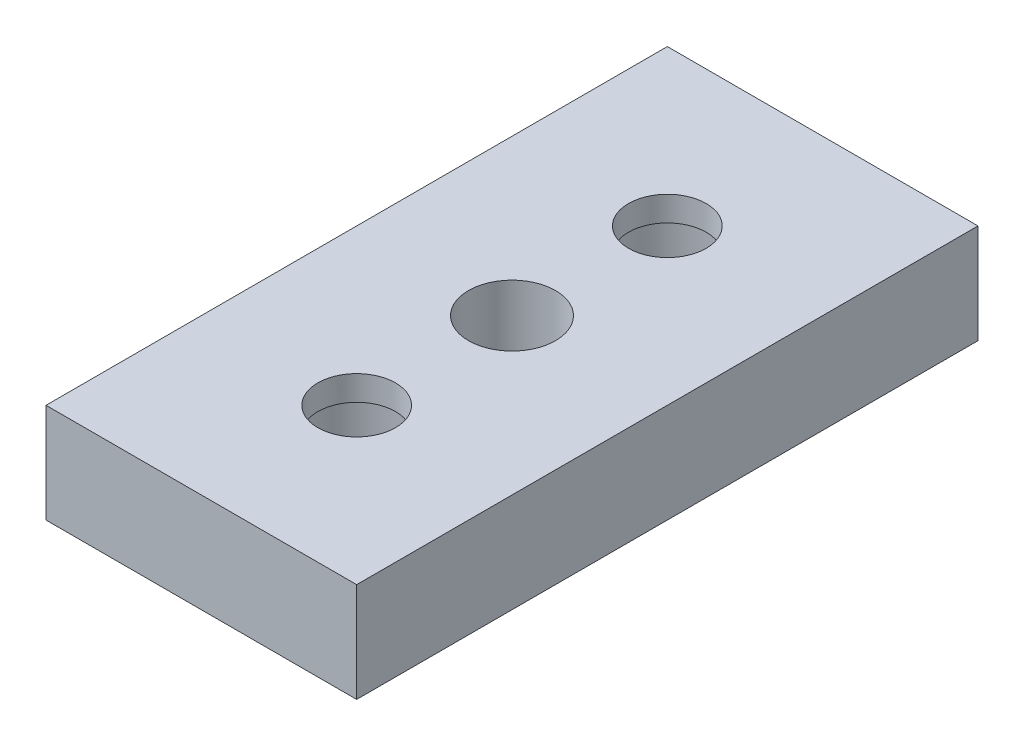
ISO-10303-21;
HEADER;
FILE_DESCRIPTION(('STEP AP214'),'2;1');
FILE_NAME('part.step','',(''),(''),'','','');
FILE_SCHEMA(('AUTOMOTIVE_DESIGN { 1 0 10303 214 1 1 1 1 }'));
ENDSEC;
DATA;
#1=APPLICATION_CONTEXT('core data for automotive mechanical design processes');
#2=APPLICATION_PROTOCOL_DEFINITION('international standard','automotive_design',2000,#1);
#3=PRODUCT_CONTEXT('',#1,'mechanical');
#4=PRODUCT('Part','Part','',(#3));
#5=PRODUCT_RELATED_PRODUCT_CATEGORY('part','',(#4));
#6=PRODUCT_DEFINITION_FORMATION('','',#4);
#7=PRODUCT_DEFINITION_CONTEXT('part definition',#1,'design');
#8=PRODUCT_DEFINITION('design','',#6,#7);
#9=PRODUCT_DEFINITION_SHAPE('','',#8);
#10=(LENGTH_UNIT() NAMED_UNIT(*) SI_UNIT(.MILLI.,.METRE.));
#11=(NAMED_UNIT(*) PLANE_ANGLE_UNIT() SI_UNIT($,.RADIAN.));
#12=(NAMED_UNIT(*) SI_UNIT($,.STERADIAN.) SOLID_ANGLE_UNIT());
#13=UNCERTAINTY_MEASURE_WITH_UNIT(LENGTH_MEASURE(1.E-05),#10,'distance_accuracy_value','');
#14=(GEOMETRIC_REPRESENTATION_CONTEXT(3) GLOBAL_UNCERTAINTY_ASSIGNED_CONTEXT((#13)) GLOBAL_UNIT_ASSIGNED_CONTEXT((#10,
#11,#12)) REPRESENTATION_CONTEXT('',''));
#15=CARTESIAN_POINT('',(0.,0.,0.));
#16=DIRECTION('',(0.,0.,1.));
#17=DIRECTION('',(1.,0.,0.));
#18=AXIS2_PLACEMENT_3D('',#15,#16,#17);
#19=CARTESIAN_POINT('',(25.,16.,-75.));
#20=DIRECTION('',(0.,-1.,0.));
#21=DIRECTION('',(0.,0.,-1.));
#22=AXIS2_PLACEMENT_3D('',#19,#20,#21);
#23=CYLINDRICAL_SURFACE('',#22,6.25);
#24=CARTESIAN_POINT('',(25.,16.,-75.));
#25=DIRECTION('',(0.,1.,0.));
#26=DIRECTION('',(0.,0.,1.));
#27=AXIS2_PLACEMENT_3D('',#24,#25,#26);
#28=CIRCLE('',#27,6.25);
#29=CARTESIAN_POINT('',(25.,16.,-68.75));
#30=VERTEX_POINT('',#29);
#31=EDGE_CURVE('E108',#30,#30,#28,.T.);
#32=ORIENTED_EDGE('',*,*,#31,.T.);
#33=EDGE_LOOP('',(#32));
#34=FACE_BOUND('',#33,.T.);
#35=CARTESIAN_POINT('',(25.,12.,-75.));
#36=DIRECTION('',(0.,-1.,0.));
#37=DIRECTION('',(0.,0.,-1.));
#38=AXIS2_PLACEMENT_3D('',#35,#36,#37);
#39=CIRCLE('',#38,6.25);
#40=CARTESIAN_POINT('',(25.,12.,-81.25));
#41=VERTEX_POINT('',#40);
#42=EDGE_CURVE('E41',#41,#41,#39,.T.);
#43=ORIENTED_EDGE('',*,*,#42,.T.);
#44=EDGE_LOOP('',(#43));
#45=FACE_BOUND('',#44,.T.);
#46=ADVANCED_FACE('F37',(#34,#45),#23,.F.);
#47=CARTESIAN_POINT('',(25.,16.,-25.));
#48=DIRECTION('',(0.,-1.,0.));
#49=DIRECTION('',(0.,0.,-1.));
#50=AXIS2_PLACEMENT_3D('',#47,#48,#49);
#51=CYLINDRICAL_SURFACE('',#50,6.25);
#52=CARTESIAN_POINT('',(25.,16.,-25.));
#53=DIRECTION('',(0.,1.,0.));
#54=DIRECTION('',(0.,0.,1.));
#55=AXIS2_PLACEMENT_3D('',#52,#53,#54);
#56=CIRCLE('',#55,6.25);
#57=CARTESIAN_POINT('',(25.,16.,-18.75));
#58=VERTEX_POINT('',#57);
#59=EDGE_CURVE('E116',#58,#58,#56,.T.);
#60=ORIENTED_EDGE('',*,*,#59,.T.);
#61=EDGE_LOOP('',(#60));
#62=FACE_BOUND('',#61,.T.);
#63=CARTESIAN_POINT('',(25.,12.,-25.));
#64=DIRECTION('',(0.,-1.,0.));
#65=DIRECTION('',(0.,0.,-1.));
#66=AXIS2_PLACEMENT_3D('',#63,#64,#65);
#67=CIRCLE('',#66,6.25);
#68=CARTESIAN_POINT('',(25.,12.,-31.25));
#69=VERTEX_POINT('',#68);
#70=EDGE_CURVE('E118',#69,#69,#67,.T.);
#71=ORIENTED_EDGE('',*,*,#70,.T.);
#72=EDGE_LOOP('',(#71));
#73=FACE_BOUND('',#72,.T.);
#74=ADVANCED_FACE('F145',(#62,#73),#51,.F.);
#75=CARTESIAN_POINT('',(0.,16.,0.));
#76=DIRECTION('',(0.,1.,0.));
#77=DIRECTION('',(0.,0.,1.));
#78=AXIS2_PLACEMENT_3D('',#75,#76,#77);
#79=PLANE('',#78);
#80=CARTESIAN_POINT('',(25.,16.,-50.));
#81=DIRECTION('',(0.,1.,0.));
#82=DIRECTION('',(0.,0.,1.));
#83=AXIS2_PLACEMENT_3D('',#80,#81,#82);
#84=CIRCLE('',#83,7.);
#85=CARTESIAN_POINT('',(25.,16.,-43.));
#86=VERTEX_POINT('',#85);
#87=EDGE_CURVE('E117',#86,#86,#84,.T.);
#88=ORIENTED_EDGE('',*,*,#87,.F.);
#89=EDGE_LOOP('',(#88));
#90=FACE_BOUND('',#89,.T.);
#91=ORIENTED_EDGE('',*,*,#31,.F.);
#92=EDGE_LOOP('',(#91));
#93=FACE_BOUND('',#92,.T.);
#94=DIRECTION('',(0.,0.,1.));
#95=VECTOR('',#94,1.);
#96=CARTESIAN_POINT('',(0.,16.,-100.));
#97=LINE('',#96,#95);
#98=CARTESIAN_POINT('',(0.,16.,-100.));
#99=VERTEX_POINT('',#98);
#100=CARTESIAN_POINT('',(0.,16.,0.));
#101=VERTEX_POINT('',#100);
#102=EDGE_CURVE('E92',#99,#101,#97,.T.);
#103=ORIENTED_EDGE('',*,*,#102,.T.);
#104=DIRECTION('',(1.,0.,0.));
#105=VECTOR('',#104,1.);
#106=CARTESIAN_POINT('',(0.,16.,0.));
#107=LINE('',#106,#105);
#108=CARTESIAN_POINT('',(50.,16.,0.));
#109=VERTEX_POINT('',#108);
#110=EDGE_CURVE('E86',#101,#109,#107,.T.);
#111=ORIENTED_EDGE('',*,*,#110,.T.);
#112=DIRECTION('',(0.,0.,-1.));
#113=VECTOR('',#112,1.);
#114=CARTESIAN_POINT('',(50.,16.,0.));
#115=LINE('',#114,#113);
#116=CARTESIAN_POINT('',(50.,16.,-100.));
#117=VERTEX_POINT('',#116);
#118=EDGE_CURVE('E90',#109,#117,#115,.T.);
#119=ORIENTED_EDGE('',*,*,#118,.T.);
#120=DIRECTION('',(-1.,0.,0.));
#121=VECTOR('',#120,1.);
#122=CARTESIAN_POINT('',(50.,16.,-100.));
#123=LINE('',#122,#121);
#124=EDGE_CURVE('E56',#117,#99,#123,.T.);
#125=ORIENTED_EDGE('',*,*,#124,.T.);
#126=EDGE_LOOP('',(#103,#111,#119,#125));
#127=FACE_BOUND('',#126,.T.);
#128=ORIENTED_EDGE('',*,*,#59,.F.);
#129=EDGE_LOOP('',(#128));
#130=FACE_BOUND('',#129,.T.);
#131=ADVANCED_FACE('F87',(#90,#93,#127,#130),#79,.T.);
#132=CARTESIAN_POINT('',(0.,0.,0.));
#133=DIRECTION('',(0.,1.,0.));
#134=DIRECTION('',(0.,0.,1.));
#135=AXIS2_PLACEMENT_3D('',#132,#133,#134);
#136=PLANE('',#135);
#137=CARTESIAN_POINT('',(25.,0.,-75.));
#138=DIRECTION('',(0.,-1.,0.));
#139=DIRECTION('',(0.,0.,-1.));
#140=AXIS2_PLACEMENT_3D('',#137,#138,#139);
#141=CIRCLE('',#140,9.25);
#142=CARTESIAN_POINT('',(25.,0.,-84.25));
#143=VERTEX_POINT('',#142);
#144=EDGE_CURVE('E133',#143,#143,#141,.T.);
#145=ORIENTED_EDGE('',*,*,#144,.F.);
#146=EDGE_LOOP('',(#145));
#147=FACE_BOUND('',#146,.T.);
#148=CARTESIAN_POINT('',(25.,0.,-25.));
#149=DIRECTION('',(0.,-1.,0.));
#150=DIRECTION('',(0.,0.,-1.));
#151=AXIS2_PLACEMENT_3D('',#148,#149,#150);
#152=CIRCLE('',#151,9.25);
#153=CARTESIAN_POINT('',(25.,0.,-34.25));
#154=VERTEX_POINT('',#153);
#155=EDGE_CURVE('E126',#154,#154,#152,.T.);
#156=ORIENTED_EDGE('',*,*,#155,.F.);
#157=EDGE_LOOP('',(#156));
#158=FACE_BOUND('',#157,.T.);
#159=CARTESIAN_POINT('',(25.,0.,-50.));
#160=DIRECTION('',(0.,1.,0.));
#161=DIRECTION('',(0.,0.,1.));
#162=AXIS2_PLACEMENT_3D('',#159,#160,#161);
#163=CIRCLE('',#162,7.);
#164=CARTESIAN_POINT('',(25.,0.,-43.));
#165=VERTEX_POINT('',#164);
#166=EDGE_CURVE('E114',#165,#165,#163,.T.);
#167=ORIENTED_EDGE('',*,*,#166,.T.);
#168=EDGE_LOOP('',(#167));
#169=FACE_BOUND('',#168,.T.);
#170=DIRECTION('',(0.,0.,1.));
#171=VECTOR('',#170,1.);
#172=CARTESIAN_POINT('',(0.,0.,-100.));
#173=LINE('',#172,#171);
#174=CARTESIAN_POINT('',(0.,0.,-100.));
#175=VERTEX_POINT('',#174);
#176=CARTESIAN_POINT('',(0.,0.,0.));
#177=VERTEX_POINT('',#176);
#178=EDGE_CURVE('E105',#175,#177,#173,.T.);
#179=ORIENTED_EDGE('',*,*,#178,.F.);
#180=DIRECTION('',(-1.,0.,0.));
#181=VECTOR('',#180,1.);
#182=CARTESIAN_POINT('',(50.,0.,-100.));
#183=LINE('',#182,#181);
#184=CARTESIAN_POINT('',(50.,0.,-100.));
#185=VERTEX_POINT('',#184);
#186=EDGE_CURVE('E79',#185,#175,#183,.T.);
#187=ORIENTED_EDGE('',*,*,#186,.F.);
#188=DIRECTION('',(0.,0.,-1.));
#189=VECTOR('',#188,1.);
#190=CARTESIAN_POINT('',(50.,0.,0.));
#191=LINE('',#190,#189);
#192=CARTESIAN_POINT('',(50.,0.,0.));
#193=VERTEX_POINT('',#192);
#194=EDGE_CURVE('E73',#193,#185,#191,.T.);
#195=ORIENTED_EDGE('',*,*,#194,.F.);
#196=DIRECTION('',(1.,0.,0.));
#197=VECTOR('',#196,1.);
#198=CARTESIAN_POINT('',(0.,0.,0.));
#199=LINE('',#198,#197);
#200=EDGE_CURVE('E96',#177,#193,#199,.T.);
#201=ORIENTED_EDGE('',*,*,#200,.F.);
#202=EDGE_LOOP('',(#179,#187,#195,#201));
#203=FACE_BOUND('',#202,.T.);
#204=ADVANCED_FACE('F144',(#147,#158,#169,#203),#136,.F.);
#205=CARTESIAN_POINT('',(0.,16.,-100.));
#206=DIRECTION('',(1.,0.,0.));
#207=DIRECTION('',(0.,0.,-1.));
#208=AXIS2_PLACEMENT_3D('',#205,#206,#207);
#209=PLANE('',#208);
#210=ORIENTED_EDGE('',*,*,#178,.T.);
#211=DIRECTION('',(0.,-1.,0.));
#212=VECTOR('',#211,1.);
#213=CARTESIAN_POINT('',(0.,16.,0.));
#214=LINE('',#213,#212);
#215=EDGE_CURVE('E11',#101,#177,#214,.T.);
#216=ORIENTED_EDGE('',*,*,#215,.F.);
#217=ORIENTED_EDGE('',*,*,#102,.F.);
#218=DIRECTION('',(0.,-1.,0.));
#219=VECTOR('',#218,1.);
#220=CARTESIAN_POINT('',(0.,16.,-100.));
#221=LINE('',#220,#219);
#222=EDGE_CURVE('E101',#99,#175,#221,.T.);
#223=ORIENTED_EDGE('',*,*,#222,.T.);
#224=EDGE_LOOP('',(#210,#216,#217,#223));
#225=FACE_BOUND('',#224,.T.);
#226=ADVANCED_FACE('F39',(#225),#209,.F.);
#227=CARTESIAN_POINT('',(0.,16.,0.));
#228=DIRECTION('',(0.,0.,-1.));
#229=DIRECTION('',(-1.,0.,0.));
#230=AXIS2_PLACEMENT_3D('',#227,#228,#229);
#231=PLANE('',#230);
#232=ORIENTED_EDGE('',*,*,#200,.T.);
#233=DIRECTION('',(0.,-1.,0.));
#234=VECTOR('',#233,1.);
#235=CARTESIAN_POINT('',(50.,16.,0.));
#236=LINE('',#235,#234);
#237=EDGE_CURVE('E47',#109,#193,#236,.T.);
#238=ORIENTED_EDGE('',*,*,#237,.F.);
#239=ORIENTED_EDGE('',*,*,#110,.F.);
#240=ORIENTED_EDGE('',*,*,#215,.T.);
#241=EDGE_LOOP('',(#232,#238,#239,#240));
#242=FACE_BOUND('',#241,.T.);
#243=ADVANCED_FACE('F95',(#242),#231,.F.);
#244=CARTESIAN_POINT('',(50.,16.,0.));
#245=DIRECTION('',(-1.,0.,0.));
#246=DIRECTION('',(0.,0.,1.));
#247=AXIS2_PLACEMENT_3D('',#244,#245,#246);
#248=PLANE('',#247);
#249=ORIENTED_EDGE('',*,*,#194,.T.);
#250=DIRECTION('',(0.,-1.,0.));
#251=VECTOR('',#250,1.);
#252=CARTESIAN_POINT('',(50.,16.,-100.));
#253=LINE('',#252,#251);
#254=EDGE_CURVE('E97',#117,#185,#253,.T.);
#255=ORIENTED_EDGE('',*,*,#254,.F.);
#256=ORIENTED_EDGE('',*,*,#118,.F.);
#257=ORIENTED_EDGE('',*,*,#237,.T.);
#258=EDGE_LOOP('',(#249,#255,#256,#257));
#259=FACE_BOUND('',#258,.T.);
#260=ADVANCED_FACE('F99',(#259),#248,.F.);
#261=CARTESIAN_POINT('',(50.,16.,-100.));
#262=DIRECTION('',(0.,0.,1.));
#263=DIRECTION('',(1.,0.,0.));
#264=AXIS2_PLACEMENT_3D('',#261,#262,#263);
#265=PLANE('',#264);
#266=ORIENTED_EDGE('',*,*,#186,.T.);
#267=ORIENTED_EDGE('',*,*,#222,.F.);
#268=ORIENTED_EDGE('',*,*,#124,.F.);
#269=ORIENTED_EDGE('',*,*,#254,.T.);
#270=EDGE_LOOP('',(#266,#267,#268,#269));
#271=FACE_BOUND('',#270,.T.);
#272=ADVANCED_FACE('F166',(#271),#265,.F.);
#273=CARTESIAN_POINT('',(25.,16.,-50.));
#274=DIRECTION('',(0.,1.,0.));
#275=DIRECTION('',(0.,0.,1.));
#276=AXIS2_PLACEMENT_3D('',#273,#274,#275);
#277=CYLINDRICAL_SURFACE('',#276,7.);
#278=ORIENTED_EDGE('',*,*,#87,.T.);
#279=EDGE_LOOP('',(#278));
#280=FACE_BOUND('',#279,.T.);
#281=ORIENTED_EDGE('',*,*,#166,.F.);
#282=EDGE_LOOP('',(#281));
#283=FACE_BOUND('',#282,.T.);
#284=ADVANCED_FACE('F162',(#280,#283),#277,.F.);
#285=CARTESIAN_POINT('',(25.,12.,-25.));
#286=DIRECTION('',(0.,-1.,0.));
#287=DIRECTION('',(0.,0.,-1.));
#288=AXIS2_PLACEMENT_3D('',#285,#286,#287);
#289=CYLINDRICAL_SURFACE('',#288,9.25);
#290=CARTESIAN_POINT('',(25.,12.,-25.));
#291=DIRECTION('',(0.,-1.,0.));
#292=DIRECTION('',(0.,0.,-1.));
#293=AXIS2_PLACEMENT_3D('',#290,#291,#292);
#294=CIRCLE('',#293,9.25);
#295=CARTESIAN_POINT('',(25.,12.,-34.25));
#296=VERTEX_POINT('',#295);
#297=EDGE_CURVE('E120',#296,#296,#294,.T.);
#298=ORIENTED_EDGE('',*,*,#297,.F.);
#299=EDGE_LOOP('',(#298));
#300=FACE_BOUND('',#299,.T.);
#301=ORIENTED_EDGE('',*,*,#155,.T.);
#302=EDGE_LOOP('',(#301));
#303=FACE_BOUND('',#302,.T.);
#304=ADVANCED_FACE('F165',(#300,#303),#289,.F.);
#305=CARTESIAN_POINT('',(25.,12.,-25.));
#306=DIRECTION('',(0.,-1.,0.));
#307=DIRECTION('',(0.,0.,-1.));
#308=AXIS2_PLACEMENT_3D('',#305,#306,#307);
#309=PLANE('',#308);
#310=ORIENTED_EDGE('',*,*,#70,.F.);
#311=EDGE_LOOP('',(#310));
#312=FACE_BOUND('',#311,.T.);
#313=ORIENTED_EDGE('',*,*,#297,.T.);
#314=EDGE_LOOP('',(#313));
#315=FACE_BOUND('',#314,.T.);
#316=ADVANCED_FACE('F170',(#312,#315),#309,.T.);
#317=CARTESIAN_POINT('',(25.,12.,-75.));
#318=DIRECTION('',(0.,-1.,0.));
#319=DIRECTION('',(0.,0.,-1.));
#320=AXIS2_PLACEMENT_3D('',#317,#318,#319);
#321=CYLINDRICAL_SURFACE('',#320,9.25);
#322=CARTESIAN_POINT('',(25.,12.,-75.));
#323=DIRECTION('',(0.,-1.,0.));
#324=DIRECTION('',(0.,0.,-1.));
#325=AXIS2_PLACEMENT_3D('',#322,#323,#324);
#326=CIRCLE('',#325,9.25);
#327=CARTESIAN_POINT('',(25.,12.,-84.25));
#328=VERTEX_POINT('',#327);
#329=EDGE_CURVE('E189',#328,#328,#326,.T.);
#330=ORIENTED_EDGE('',*,*,#329,.F.);
#331=EDGE_LOOP('',(#330));
#332=FACE_BOUND('',#331,.T.);
#333=ORIENTED_EDGE('',*,*,#144,.T.);
#334=EDGE_LOOP('',(#333));
#335=FACE_BOUND('',#334,.T.);
#336=ADVANCED_FACE('F174',(#332,#335),#321,.F.);
#337=CARTESIAN_POINT('',(25.,12.,-75.));
#338=DIRECTION('',(0.,-1.,0.));
#339=DIRECTION('',(0.,0.,-1.));
#340=AXIS2_PLACEMENT_3D('',#337,#338,#339);
#341=PLANE('',#340);
#342=ORIENTED_EDGE('',*,*,#42,.F.);
#343=EDGE_LOOP('',(#342));
#344=FACE_BOUND('',#343,.T.);
#345=ORIENTED_EDGE('',*,*,#329,.T.);
#346=EDGE_LOOP('',(#345));
#347=FACE_BOUND('',#346,.T.);
#348=ADVANCED_FACE('F178',(#344,#347),#341,.T.);
#349=CLOSED_SHELL('',(#46,#74,#131,#204,#226,#243,#260,#272,#284,#304,#316,#336,#348));
#350=MANIFOLD_SOLID_BREP('B2',#349);
#351=ADVANCED_BREP_SHAPE_REPRESENTATION('',(#18,#350),#14);
#352=SHAPE_DEFINITION_REPRESENTATION(#9,#351);
ENDSEC;
END-ISO-10303-21;
